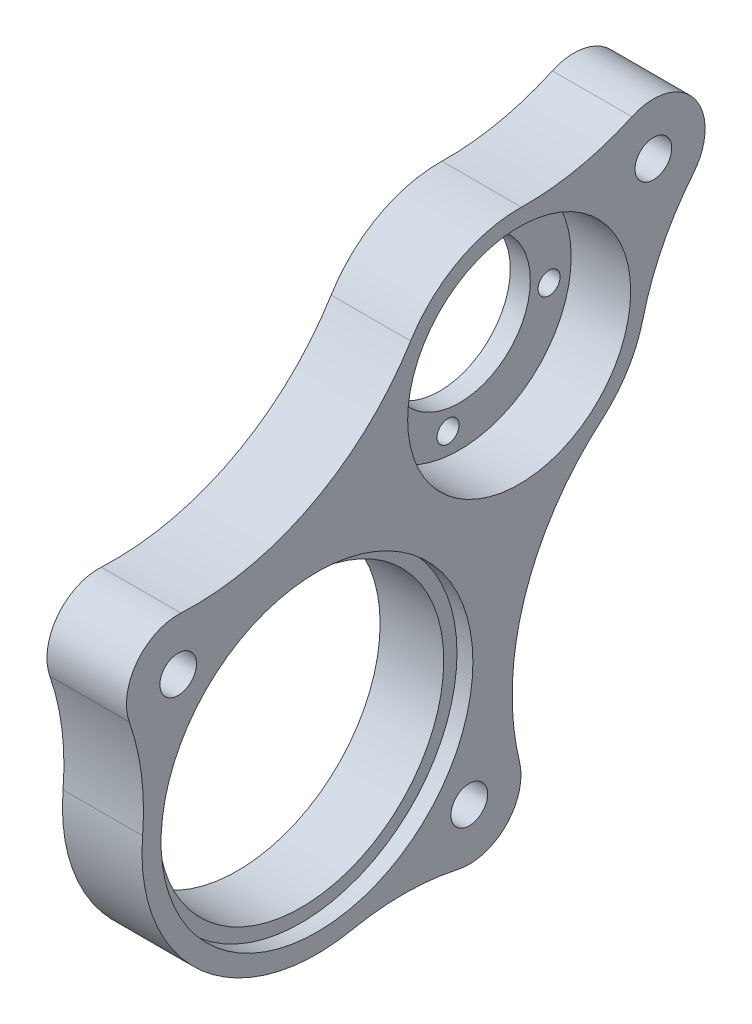
ISO-10303-21;
HEADER;
FILE_DESCRIPTION(('STEP AP214'),'2;1');
FILE_NAME('part.step','',(''),(''),'','','');
FILE_SCHEMA(('AUTOMOTIVE_DESIGN { 1 0 10303 214 1 1 1 1 }'));
ENDSEC;
DATA;
#1=APPLICATION_CONTEXT('core data for automotive mechanical design processes');
#2=APPLICATION_PROTOCOL_DEFINITION('international standard','automotive_design',2000,#1);
#3=PRODUCT_CONTEXT('',#1,'mechanical');
#4=PRODUCT('Part','Part','',(#3));
#5=PRODUCT_RELATED_PRODUCT_CATEGORY('part','',(#4));
#6=PRODUCT_DEFINITION_FORMATION('','',#4);
#7=PRODUCT_DEFINITION_CONTEXT('part definition',#1,'design');
#8=PRODUCT_DEFINITION('design','',#6,#7);
#9=PRODUCT_DEFINITION_SHAPE('','',#8);
#10=(LENGTH_UNIT() NAMED_UNIT(*) SI_UNIT(.MILLI.,.METRE.));
#11=(NAMED_UNIT(*) PLANE_ANGLE_UNIT() SI_UNIT($,.RADIAN.));
#12=(NAMED_UNIT(*) SI_UNIT($,.STERADIAN.) SOLID_ANGLE_UNIT());
#13=UNCERTAINTY_MEASURE_WITH_UNIT(LENGTH_MEASURE(1.E-05),#10,'distance_accuracy_value','');
#14=(GEOMETRIC_REPRESENTATION_CONTEXT(3) GLOBAL_UNCERTAINTY_ASSIGNED_CONTEXT((#13)) GLOBAL_UNIT_ASSIGNED_CONTEXT((#10,
#11,#12)) REPRESENTATION_CONTEXT('',''));
#15=CARTESIAN_POINT('',(0.,0.,0.));
#16=DIRECTION('',(0.,0.,1.));
#17=DIRECTION('',(1.,0.,0.));
#18=AXIS2_PLACEMENT_3D('',#15,#16,#17);
#19=CARTESIAN_POINT('',(-54.0385,40.64,-143.949968041871));
#20=DIRECTION('',(1.,0.,0.));
#21=DIRECTION('',(0.,0.,-1.));
#22=AXIS2_PLACEMENT_3D('',#19,#20,#21);
#23=CYLINDRICAL_SURFACE('',#22,14.2367);
#24=CARTESIAN_POINT('',(-54.0385,40.64,-143.949968041871));
#25=DIRECTION('',(-1.,0.,0.));
#26=DIRECTION('',(0.,0.,1.));
#27=AXIS2_PLACEMENT_3D('',#24,#25,#26);
#28=CIRCLE('',#27,14.2367);
#29=CARTESIAN_POINT('',(-54.0385,40.64,-129.713268041871));
#30=VERTEX_POINT('',#29);
#31=EDGE_CURVE('E186',#30,#30,#28,.T.);
#32=ORIENTED_EDGE('',*,*,#31,.T.);
#33=EDGE_LOOP('',(#32));
#34=FACE_BOUND('',#33,.T.);
#35=CARTESIAN_POINT('',(-47.6885,40.64,-143.949968041871));
#36=DIRECTION('',(1.,0.,0.));
#37=DIRECTION('',(0.,0.,-1.));
#38=AXIS2_PLACEMENT_3D('',#35,#36,#37);
#39=CIRCLE('',#38,14.2367);
#40=CARTESIAN_POINT('',(-47.6885,40.64,-158.186668041871));
#41=VERTEX_POINT('',#40);
#42=EDGE_CURVE('E57',#41,#41,#39,.T.);
#43=ORIENTED_EDGE('',*,*,#42,.T.);
#44=EDGE_LOOP('',(#43));
#45=FACE_BOUND('',#44,.T.);
#46=ADVANCED_FACE('F53',(#34,#45),#23,.F.);
#47=CARTESIAN_POINT('',(-54.0385,73.7443887278039,-165.280840759905));
#48=DIRECTION('',(1.,0.,0.));
#49=DIRECTION('',(0.,0.,-1.));
#50=AXIS2_PLACEMENT_3D('',#47,#48,#49);
#51=CYLINDRICAL_SURFACE('',#50,1.09999999999988);
#52=CARTESIAN_POINT('',(-54.0385,73.7443887278039,-165.280840759905));
#53=DIRECTION('',(-1.,0.,0.));
#54=DIRECTION('',(0.,0.,1.));
#55=AXIS2_PLACEMENT_3D('',#52,#53,#54);
#56=CIRCLE('',#55,1.09999999999988);
#57=CARTESIAN_POINT('',(-54.0385,73.7443887278039,-164.180840759905));
#58=VERTEX_POINT('',#57);
#59=EDGE_CURVE('E198',#58,#58,#56,.T.);
#60=ORIENTED_EDGE('',*,*,#59,.T.);
#61=EDGE_LOOP('',(#60));
#62=FACE_BOUND('',#61,.T.);
#63=CARTESIAN_POINT('',(-52.0385,73.7443887278039,-165.280840759905));
#64=DIRECTION('',(1.,0.,0.));
#65=DIRECTION('',(0.,0.,-1.));
#66=AXIS2_PLACEMENT_3D('',#63,#64,#65);
#67=CIRCLE('',#66,1.09999999999988);
#68=CARTESIAN_POINT('',(-52.0385,73.7443887278039,-166.380840759905));
#69=VERTEX_POINT('',#68);
#70=EDGE_CURVE('E208',#69,#69,#67,.T.);
#71=ORIENTED_EDGE('',*,*,#70,.T.);
#72=EDGE_LOOP('',(#71));
#73=FACE_BOUND('',#72,.T.);
#74=ADVANCED_FACE('F362',(#62,#73),#51,.F.);
#75=CARTESIAN_POINT('',(-54.0385,63.6625242944224,-173.049753782131));
#76=DIRECTION('',(1.,0.,0.));
#77=DIRECTION('',(0.,0.,-1.));
#78=AXIS2_PLACEMENT_3D('',#75,#76,#77);
#79=CYLINDRICAL_SURFACE('',#78,1.09999999999999);
#80=CARTESIAN_POINT('',(-54.0385,63.6625242944224,-173.049753782131));
#81=DIRECTION('',(-1.,0.,0.));
#82=DIRECTION('',(0.,0.,1.));
#83=AXIS2_PLACEMENT_3D('',#80,#81,#82);
#84=CIRCLE('',#83,1.09999999999999);
#85=CARTESIAN_POINT('',(-54.0385,63.6625242944224,-171.949753782131));
#86=VERTEX_POINT('',#85);
#87=EDGE_CURVE('E195',#86,#86,#84,.T.);
#88=ORIENTED_EDGE('',*,*,#87,.T.);
#89=EDGE_LOOP('',(#88));
#90=FACE_BOUND('',#89,.T.);
#91=CARTESIAN_POINT('',(-52.0385,63.6625242944224,-173.049753782131));
#92=DIRECTION('',(1.,0.,0.));
#93=DIRECTION('',(0.,0.,-1.));
#94=AXIS2_PLACEMENT_3D('',#91,#92,#93);
#95=CIRCLE('',#94,1.09999999999999);
#96=CARTESIAN_POINT('',(-52.0385,63.6625242944224,-174.149753782131));
#97=VERTEX_POINT('',#96);
#98=EDGE_CURVE('E308',#97,#97,#95,.T.);
#99=ORIENTED_EDGE('',*,*,#98,.T.);
#100=EDGE_LOOP('',(#99));
#101=FACE_BOUND('',#100,.T.);
#102=ADVANCED_FACE('F368',(#90,#101),#79,.F.);
#103=CARTESIAN_POINT('',(-54.0385,55.8936112721961,-162.96788934875));
#104=DIRECTION('',(1.,0.,0.));
#105=DIRECTION('',(0.,0.,-1.));
#106=AXIS2_PLACEMENT_3D('',#103,#104,#105);
#107=CYLINDRICAL_SURFACE('',#106,1.09999999999964);
#108=CARTESIAN_POINT('',(-54.0385,55.8936112721961,-162.96788934875));
#109=DIRECTION('',(-1.,0.,0.));
#110=DIRECTION('',(0.,0.,1.));
#111=AXIS2_PLACEMENT_3D('',#108,#109,#110);
#112=CIRCLE('',#111,1.09999999999964);
#113=CARTESIAN_POINT('',(-54.0385,55.8936112721961,-161.86788934875));
#114=VERTEX_POINT('',#113);
#115=EDGE_CURVE('E192',#114,#114,#112,.T.);
#116=ORIENTED_EDGE('',*,*,#115,.T.);
#117=EDGE_LOOP('',(#116));
#118=FACE_BOUND('',#117,.T.);
#119=CARTESIAN_POINT('',(-52.0385,55.8936112721961,-162.96788934875));
#120=DIRECTION('',(1.,0.,0.));
#121=DIRECTION('',(0.,0.,-1.));
#122=AXIS2_PLACEMENT_3D('',#119,#120,#121);
#123=CIRCLE('',#122,1.09999999999964);
#124=CARTESIAN_POINT('',(-52.0385,55.8936112721961,-164.067889348749));
#125=VERTEX_POINT('',#124);
#126=EDGE_CURVE('E305',#125,#125,#123,.T.);
#127=ORIENTED_EDGE('',*,*,#126,.T.);
#128=EDGE_LOOP('',(#127));
#129=FACE_BOUND('',#128,.T.);
#130=ADVANCED_FACE('F613',(#118,#129),#107,.F.);
#131=CARTESIAN_POINT('',(-54.0385,65.9754757055776,-155.198976326523));
#132=DIRECTION('',(1.,0.,0.));
#133=DIRECTION('',(0.,0.,-1.));
#134=AXIS2_PLACEMENT_3D('',#131,#132,#133);
#135=CYLINDRICAL_SURFACE('',#134,1.10000000000011);
#136=CARTESIAN_POINT('',(-54.0385,65.9754757055776,-155.198976326523));
#137=DIRECTION('',(-1.,0.,0.));
#138=DIRECTION('',(0.,0.,1.));
#139=AXIS2_PLACEMENT_3D('',#136,#137,#138);
#140=CIRCLE('',#139,1.10000000000011);
#141=CARTESIAN_POINT('',(-54.0385,65.9754757055776,-154.098976326523));
#142=VERTEX_POINT('',#141);
#143=EDGE_CURVE('E189',#142,#142,#140,.T.);
#144=ORIENTED_EDGE('',*,*,#143,.T.);
#145=EDGE_LOOP('',(#144));
#146=FACE_BOUND('',#145,.T.);
#147=CARTESIAN_POINT('',(-52.0385,65.9754757055776,-155.198976326523));
#148=DIRECTION('',(1.,0.,0.));
#149=DIRECTION('',(0.,0.,-1.));
#150=AXIS2_PLACEMENT_3D('',#147,#148,#149);
#151=CIRCLE('',#150,1.10000000000011);
#152=CARTESIAN_POINT('',(-52.0385,65.9754757055776,-156.298976326523));
#153=VERTEX_POINT('',#152);
#154=EDGE_CURVE('E258',#153,#153,#151,.T.);
#155=ORIENTED_EDGE('',*,*,#154,.T.);
#156=EDGE_LOOP('',(#155));
#157=FACE_BOUND('',#156,.T.);
#158=ADVANCED_FACE('F374',(#146,#157),#135,.F.);
#159=CARTESIAN_POINT('',(-54.0385,64.819,-164.124365054327));
#160=DIRECTION('',(1.,0.,0.));
#161=DIRECTION('',(0.,0.,-1.));
#162=AXIS2_PLACEMENT_3D('',#159,#160,#161);
#163=CYLINDRICAL_SURFACE('',#162,7.05000000000001);
#164=CARTESIAN_POINT('',(-54.0385,64.819,-164.124365054327));
#165=DIRECTION('',(-1.,0.,0.));
#166=DIRECTION('',(0.,0.,1.));
#167=AXIS2_PLACEMENT_3D('',#164,#165,#166);
#168=CIRCLE('',#167,7.05000000000001);
#169=CARTESIAN_POINT('',(-54.0385,64.819,-157.074365054327));
#170=VERTEX_POINT('',#169);
#171=EDGE_CURVE('E201',#170,#170,#168,.T.);
#172=ORIENTED_EDGE('',*,*,#171,.T.);
#173=EDGE_LOOP('',(#172));
#174=FACE_BOUND('',#173,.T.);
#175=CARTESIAN_POINT('',(-52.0385,64.819,-164.124365054327));
#176=DIRECTION('',(1.,0.,0.));
#177=DIRECTION('',(0.,0.,-1.));
#178=AXIS2_PLACEMENT_3D('',#175,#176,#177);
#179=CIRCLE('',#178,7.05000000000001);
#180=CARTESIAN_POINT('',(-52.0385,64.819,-171.174365054327));
#181=VERTEX_POINT('',#180);
#182=EDGE_CURVE('E255',#181,#181,#179,.T.);
#183=ORIENTED_EDGE('',*,*,#182,.T.);
#184=EDGE_LOOP('',(#183));
#185=FACE_BOUND('',#184,.T.);
#186=ADVANCED_FACE('F359',(#174,#185),#163,.F.);
#187=CARTESIAN_POINT('',(-54.0385,28.5019500000001,-159.144486375717));
#188=DIRECTION('',(1.,0.,0.));
#189=DIRECTION('',(0.,0.,-1.));
#190=AXIS2_PLACEMENT_3D('',#187,#188,#189);
#191=CYLINDRICAL_SURFACE('',#190,5.16000999999998);
#192=CARTESIAN_POINT('',(-46.101,28.5019500000001,-159.144486375717));
#193=DIRECTION('',(-1.,0.,0.));
#194=DIRECTION('',(0.,0.,1.));
#195=AXIS2_PLACEMENT_3D('',#192,#193,#194);
#196=CIRCLE('',#195,5.16000999999998);
#197=CARTESIAN_POINT('',(-46.101,29.732471235992,-164.155626035303));
#198=VERTEX_POINT('',#197);
#199=CARTESIAN_POINT('',(-46.101,23.462389320862,-158.036095036259));
#200=VERTEX_POINT('',#199);
#201=EDGE_CURVE('E205',#198,#200,#196,.T.);
#202=ORIENTED_EDGE('',*,*,#201,.T.);
#203=DIRECTION('',(1.,0.,0.));
#204=VECTOR('',#203,1.);
#205=CARTESIAN_POINT('',(-54.0385,23.462389320862,-158.036095036259));
#206=LINE('',#205,#204);
#207=CARTESIAN_POINT('',(-54.0385,23.462389320862,-158.036095036259));
#208=VERTEX_POINT('',#207);
#209=EDGE_CURVE('E70',#200,#208,#206,.F.);
#210=ORIENTED_EDGE('',*,*,#209,.T.);
#211=CARTESIAN_POINT('',(-54.0385,28.5019500000001,-159.144486375717));
#212=DIRECTION('',(-1.,0.,0.));
#213=DIRECTION('',(0.,0.,1.));
#214=AXIS2_PLACEMENT_3D('',#211,#212,#213);
#215=CIRCLE('',#214,5.16000999999998);
#216=CARTESIAN_POINT('',(-54.0385,29.732471235992,-164.155626035303));
#217=VERTEX_POINT('',#216);
#218=EDGE_CURVE('E227',#217,#208,#215,.T.);
#219=ORIENTED_EDGE('',*,*,#218,.F.);
#220=DIRECTION('',(1.,0.,0.));
#221=VECTOR('',#220,1.);
#222=CARTESIAN_POINT('',(-54.0385,29.732471235992,-164.155626035303));
#223=LINE('',#222,#221);
#224=EDGE_CURVE('E204',#217,#198,#223,.T.);
#225=ORIENTED_EDGE('',*,*,#224,.T.);
#226=EDGE_LOOP('',(#202,#210,#219,#225));
#227=FACE_BOUND('',#226,.T.);
#228=ADVANCED_FACE('F349',(#227),#191,.T.);
#229=CARTESIAN_POINT('',(-54.0385,40.64,-143.949968041871));
#230=DIRECTION('',(1.,0.,0.));
#231=DIRECTION('',(0.,0.,-1.));
#232=AXIS2_PLACEMENT_3D('',#229,#230,#231);
#233=CYLINDRICAL_SURFACE('',#232,17.4625);
#234=CARTESIAN_POINT('',(-46.101,40.64,-143.949968041871));
#235=DIRECTION('',(-1.,0.,0.));
#236=DIRECTION('',(0.,0.,1.));
#237=AXIS2_PLACEMENT_3D('',#234,#235,#236);
#238=CIRCLE('',#237,17.4625);
#239=CARTESIAN_POINT('',(-46.101,23.5351212523761,-147.465935800409));
#240=VERTEX_POINT('',#239);
#241=CARTESIAN_POINT('',(-46.101,42.108524142811,-126.549326010843));
#242=VERTEX_POINT('',#241);
#243=EDGE_CURVE('E207',#240,#242,#238,.T.);
#244=ORIENTED_EDGE('',*,*,#243,.T.);
#245=DIRECTION('',(1.,0.,0.));
#246=VECTOR('',#245,1.);
#247=CARTESIAN_POINT('',(-54.0385,42.108524142811,-126.549326010843));
#248=LINE('',#247,#246);
#249=CARTESIAN_POINT('',(-54.0385,42.108524142811,-126.549326010843));
#250=VERTEX_POINT('',#249);
#251=EDGE_CURVE('E248',#242,#250,#248,.F.);
#252=ORIENTED_EDGE('',*,*,#251,.T.);
#253=CARTESIAN_POINT('',(-54.0385,40.64,-143.949968041871));
#254=DIRECTION('',(-1.,0.,0.));
#255=DIRECTION('',(0.,0.,1.));
#256=AXIS2_PLACEMENT_3D('',#253,#254,#255);
#257=CIRCLE('',#256,17.4625);
#258=CARTESIAN_POINT('',(-54.0385,23.5351212523761,-147.465935800409));
#259=VERTEX_POINT('',#258);
#260=EDGE_CURVE('E156',#259,#250,#257,.T.);
#261=ORIENTED_EDGE('',*,*,#260,.F.);
#262=DIRECTION('',(1.,0.,0.));
#263=VECTOR('',#262,1.);
#264=CARTESIAN_POINT('',(-54.0385,23.5351212523761,-147.465935800409));
#265=LINE('',#264,#263);
#266=EDGE_CURVE('E245',#259,#240,#265,.T.);
#267=ORIENTED_EDGE('',*,*,#266,.T.);
#268=EDGE_LOOP('',(#244,#252,#261,#267));
#269=FACE_BOUND('',#268,.T.);
#270=ADVANCED_FACE('F351',(#269),#233,.T.);
#271=CARTESIAN_POINT('',(-54.0385,54.2924889549761,-130.100231924011));
#272=DIRECTION('',(1.,0.,0.));
#273=DIRECTION('',(0.,0.,-1.));
#274=AXIS2_PLACEMENT_3D('',#271,#272,#273);
#275=CYLINDRICAL_SURFACE('',#274,5.16000999999998);
#276=CARTESIAN_POINT('',(-54.0385,54.2924889549761,-130.100231924011));
#277=DIRECTION('',(-1.,0.,0.));
#278=DIRECTION('',(0.,0.,1.));
#279=AXIS2_PLACEMENT_3D('',#276,#277,#278);
#280=CIRCLE('',#279,5.16000999999998);
#281=CARTESIAN_POINT('',(-54.0385,52.5959117055806,-125.22710881486));
#282=VERTEX_POINT('',#281);
#283=CARTESIAN_POINT('',(-54.0385,59.4456484389902,-130.36603360274));
#284=VERTEX_POINT('',#283);
#285=EDGE_CURVE('E144',#282,#284,#280,.T.);
#286=ORIENTED_EDGE('',*,*,#285,.F.);
#287=DIRECTION('',(1.,0.,0.));
#288=VECTOR('',#287,1.);
#289=CARTESIAN_POINT('',(-54.0385,52.5959117055806,-125.22710881486));
#290=LINE('',#289,#288);
#291=CARTESIAN_POINT('',(-46.101,52.5959117055806,-125.22710881486));
#292=VERTEX_POINT('',#291);
#293=EDGE_CURVE('E166',#282,#292,#290,.T.);
#294=ORIENTED_EDGE('',*,*,#293,.T.);
#295=CARTESIAN_POINT('',(-46.101,54.2924889549761,-130.100231924011));
#296=DIRECTION('',(-1.,0.,0.));
#297=DIRECTION('',(0.,0.,1.));
#298=AXIS2_PLACEMENT_3D('',#295,#296,#297);
#299=CIRCLE('',#298,5.16000999999998);
#300=CARTESIAN_POINT('',(-46.101,59.4456484389902,-130.36603360274));
#301=VERTEX_POINT('',#300);
#302=EDGE_CURVE('E162',#292,#301,#299,.T.);
#303=ORIENTED_EDGE('',*,*,#302,.T.);
#304=DIRECTION('',(1.,0.,0.));
#305=VECTOR('',#304,1.);
#306=CARTESIAN_POINT('',(-54.0385,59.4456484389902,-130.36603360274));
#307=LINE('',#306,#305);
#308=EDGE_CURVE('E159',#284,#301,#307,.T.);
#309=ORIENTED_EDGE('',*,*,#308,.F.);
#310=EDGE_LOOP('',(#286,#294,#303,#309));
#311=FACE_BOUND('',#310,.T.);
#312=ADVANCED_FACE('F160',(#311),#275,.T.);
#313=CARTESIAN_POINT('',(-54.0385,84.8119269721633,-131.674434679429));
#314=DIRECTION('',(1.,0.,0.));
#315=DIRECTION('',(0.,0.,-1.));
#316=AXIS2_PLACEMENT_3D('',#313,#314,#315);
#317=CYLINDRICAL_SURFACE('',#316,25.4);
#318=CARTESIAN_POINT('',(-46.101,84.8119269721633,-131.674434679429));
#319=DIRECTION('',(-1.,0.,0.));
#320=DIRECTION('',(0.,0.,1.));
#321=AXIS2_PLACEMENT_3D('',#318,#319,#320);
#322=CIRCLE('',#321,25.4);
#323=CARTESIAN_POINT('',(-46.101,71.4883796320972,-153.299491587493));
#324=VERTEX_POINT('',#323);
#325=EDGE_CURVE('E212',#324,#301,#322,.T.);
#326=ORIENTED_EDGE('',*,*,#325,.F.);
#327=DIRECTION('',(1.,0.,0.));
#328=VECTOR('',#327,1.);
#329=CARTESIAN_POINT('',(-54.0385,71.4883796320972,-153.299491587493));
#330=LINE('',#329,#328);
#331=CARTESIAN_POINT('',(-54.0385,71.4883796320972,-153.299491587493));
#332=VERTEX_POINT('',#331);
#333=EDGE_CURVE('E167',#332,#324,#330,.T.);
#334=ORIENTED_EDGE('',*,*,#333,.F.);
#335=CARTESIAN_POINT('',(-54.0385,84.8119269721633,-131.674434679429));
#336=DIRECTION('',(-1.,0.,0.));
#337=DIRECTION('',(0.,0.,1.));
#338=AXIS2_PLACEMENT_3D('',#335,#336,#337);
#339=CIRCLE('',#338,25.4);
#340=EDGE_CURVE('E149',#332,#284,#339,.T.);
#341=ORIENTED_EDGE('',*,*,#340,.T.);
#342=ORIENTED_EDGE('',*,*,#308,.T.);
#343=EDGE_LOOP('',(#326,#334,#341,#342));
#344=FACE_BOUND('',#343,.T.);
#345=ADVANCED_FACE('F169',(#344),#317,.F.);
#346=CARTESIAN_POINT('',(-54.0385,64.819,-164.124365054327));
#347=DIRECTION('',(1.,0.,0.));
#348=DIRECTION('',(0.,0.,-1.));
#349=AXIS2_PLACEMENT_3D('',#346,#347,#348);
#350=CYLINDRICAL_SURFACE('',#349,12.7145);
#351=CARTESIAN_POINT('',(-46.101,64.819,-164.124365054327));
#352=DIRECTION('',(-1.,0.,0.));
#353=DIRECTION('',(0.,0.,1.));
#354=AXIS2_PLACEMENT_3D('',#351,#352,#353);
#355=CIRCLE('',#354,12.7145);
#356=CARTESIAN_POINT('',(-46.101,77.531503941374,-164.349651073758));
#357=VERTEX_POINT('',#356);
#358=EDGE_CURVE('E214',#324,#357,#355,.T.);
#359=ORIENTED_EDGE('',*,*,#358,.T.);
#360=DIRECTION('',(1.,0.,0.));
#361=VECTOR('',#360,1.);
#362=CARTESIAN_POINT('',(-54.0385,77.531503941374,-164.349651073758));
#363=LINE('',#362,#361);
#364=CARTESIAN_POINT('',(-54.0385,77.531503941374,-164.349651073758));
#365=VERTEX_POINT('',#364);
#366=EDGE_CURVE('E241',#365,#357,#363,.T.);
#367=ORIENTED_EDGE('',*,*,#366,.F.);
#368=CARTESIAN_POINT('',(-54.0385,64.819,-164.124365054327));
#369=DIRECTION('',(-1.,0.,0.));
#370=DIRECTION('',(0.,0.,1.));
#371=AXIS2_PLACEMENT_3D('',#368,#369,#370);
#372=CIRCLE('',#371,12.7145);
#373=EDGE_CURVE('E171',#332,#365,#372,.T.);
#374=ORIENTED_EDGE('',*,*,#373,.F.);
#375=ORIENTED_EDGE('',*,*,#333,.T.);
#376=EDGE_LOOP('',(#359,#367,#374,#375));
#377=FACE_BOUND('',#376,.T.);
#378=ADVANCED_FACE('F326',(#377),#350,.T.);
#379=CARTESIAN_POINT('',(-54.0385,102.927516376853,-164.79970926665));
#380=DIRECTION('',(1.,0.,0.));
#381=DIRECTION('',(0.,0.,-1.));
#382=AXIS2_PLACEMENT_3D('',#379,#380,#381);
#383=CYLINDRICAL_SURFACE('',#382,25.4);
#384=CARTESIAN_POINT('',(-46.101,102.927516376853,-164.79970926665));
#385=DIRECTION('',(-1.,0.,0.));
#386=DIRECTION('',(0.,0.,1.));
#387=AXIS2_PLACEMENT_3D('',#384,#385,#386);
#388=CIRCLE('',#387,25.4);
#389=CARTESIAN_POINT('',(-46.101,79.8315047599698,-175.37015142357));
#390=VERTEX_POINT('',#389);
#391=EDGE_CURVE('E217',#390,#357,#388,.T.);
#392=ORIENTED_EDGE('',*,*,#391,.F.);
#393=DIRECTION('',(1.,0.,0.));
#394=VECTOR('',#393,1.);
#395=CARTESIAN_POINT('',(-54.0385,79.8315047599698,-175.37015142357));
#396=LINE('',#395,#394);
#397=CARTESIAN_POINT('',(-54.0385,79.8315047599698,-175.37015142357));
#398=VERTEX_POINT('',#397);
#399=EDGE_CURVE('E239',#398,#390,#396,.T.);
#400=ORIENTED_EDGE('',*,*,#399,.F.);
#401=CARTESIAN_POINT('',(-54.0385,102.927516376853,-164.79970926665));
#402=DIRECTION('',(-1.,0.,0.));
#403=DIRECTION('',(0.,0.,1.));
#404=AXIS2_PLACEMENT_3D('',#401,#402,#403);
#405=CIRCLE('',#404,25.4);
#406=EDGE_CURVE('E173',#398,#365,#405,.T.);
#407=ORIENTED_EDGE('',*,*,#406,.T.);
#408=ORIENTED_EDGE('',*,*,#366,.T.);
#409=EDGE_LOOP('',(#392,#400,#407,#408));
#410=FACE_BOUND('',#409,.T.);
#411=ADVANCED_FACE('F331',(#410),#383,.F.);
#412=CARTESIAN_POINT('',(-54.0385,75.1395499999999,-177.517536747748));
#413=DIRECTION('',(1.,0.,0.));
#414=DIRECTION('',(0.,0.,-1.));
#415=AXIS2_PLACEMENT_3D('',#412,#413,#414);
#416=CYLINDRICAL_SURFACE('',#415,5.16000999999998);
#417=CARTESIAN_POINT('',(-46.101,75.1395499999999,-177.517536747748));
#418=DIRECTION('',(-1.,0.,0.));
#419=DIRECTION('',(0.,0.,1.));
#420=AXIS2_PLACEMENT_3D('',#417,#418,#419);
#421=CIRCLE('',#420,5.16000999999998);
#422=CARTESIAN_POINT('',(-46.101,71.8672672912919,-181.507257173341));
#423=VERTEX_POINT('',#422);
#424=EDGE_CURVE('E221',#390,#423,#421,.T.);
#425=ORIENTED_EDGE('',*,*,#424,.T.);
#426=DIRECTION('',(1.,0.,0.));
#427=VECTOR('',#426,1.);
#428=CARTESIAN_POINT('',(-54.0385,71.8672672912919,-181.507257173341));
#429=LINE('',#428,#427);
#430=CARTESIAN_POINT('',(-54.0385,71.8672672912919,-181.507257173341));
#431=VERTEX_POINT('',#430);
#432=EDGE_CURVE('E236',#431,#423,#429,.T.);
#433=ORIENTED_EDGE('',*,*,#432,.F.);
#434=CARTESIAN_POINT('',(-54.0385,75.1395499999999,-177.517536747748));
#435=DIRECTION('',(-1.,0.,0.));
#436=DIRECTION('',(0.,0.,1.));
#437=AXIS2_PLACEMENT_3D('',#434,#435,#436);
#438=CIRCLE('',#437,5.16000999999998);
#439=EDGE_CURVE('E180',#398,#431,#438,.T.);
#440=ORIENTED_EDGE('',*,*,#439,.F.);
#441=ORIENTED_EDGE('',*,*,#399,.T.);
#442=EDGE_LOOP('',(#425,#433,#440,#441));
#443=FACE_BOUND('',#442,.T.);
#444=ADVANCED_FACE('F333',(#443),#416,.T.);
#445=CARTESIAN_POINT('',(-54.0385,55.7595502905137,-201.14654058753));
#446=DIRECTION('',(1.,0.,0.));
#447=DIRECTION('',(0.,0.,-1.));
#448=AXIS2_PLACEMENT_3D('',#445,#446,#447);
#449=CYLINDRICAL_SURFACE('',#448,25.4);
#450=CARTESIAN_POINT('',(-46.101,55.7595502905137,-201.14654058753));
#451=DIRECTION('',(-1.,0.,0.));
#452=DIRECTION('',(0.,0.,1.));
#453=AXIS2_PLACEMENT_3D('',#450,#451,#452);
#454=CIRCLE('',#453,25.4);
#455=CARTESIAN_POINT('',(-46.101,61.7968857565687,-176.474479861472));
#456=VERTEX_POINT('',#455);
#457=EDGE_CURVE('E223',#423,#456,#454,.F.);
#458=ORIENTED_EDGE('',*,*,#457,.T.);
#459=DIRECTION('',(1.,0.,0.));
#460=VECTOR('',#459,1.);
#461=CARTESIAN_POINT('',(-54.0385,61.7968857565687,-176.474479861472));
#462=LINE('',#461,#460);
#463=CARTESIAN_POINT('',(-54.0385,61.7968857565687,-176.474479861472));
#464=VERTEX_POINT('',#463);
#465=EDGE_CURVE('E233',#464,#456,#462,.T.);
#466=ORIENTED_EDGE('',*,*,#465,.F.);
#467=CARTESIAN_POINT('',(-54.0385,55.7595502905137,-201.14654058753));
#468=DIRECTION('',(-1.,0.,0.));
#469=DIRECTION('',(0.,0.,1.));
#470=AXIS2_PLACEMENT_3D('',#467,#468,#469);
#471=CIRCLE('',#470,25.4);
#472=EDGE_CURVE('E182',#431,#464,#471,.F.);
#473=ORIENTED_EDGE('',*,*,#472,.F.);
#474=ORIENTED_EDGE('',*,*,#432,.T.);
#475=EDGE_LOOP('',(#458,#466,#473,#474));
#476=FACE_BOUND('',#475,.T.);
#477=ADVANCED_FACE('F338',(#476),#449,.F.);
#478=CARTESIAN_POINT('',(-46.101,55.1351963431537,-172.363446130858));
#479=VERTEX_POINT('',#478);
#480=EDGE_CURVE('E218',#456,#479,#355,.T.);
#481=ORIENTED_EDGE('',*,*,#480,.T.);
#482=DIRECTION('',(1.,0.,0.));
#483=VECTOR('',#482,1.);
#484=CARTESIAN_POINT('',(-54.0385,55.1351963431537,-172.363446130858));
#485=LINE('',#484,#483);
#486=CARTESIAN_POINT('',(-54.0385,55.1351963431537,-172.363446130858));
#487=VERTEX_POINT('',#486);
#488=EDGE_CURVE('E230',#487,#479,#485,.T.);
#489=ORIENTED_EDGE('',*,*,#488,.F.);
#490=EDGE_CURVE('E175',#464,#487,#372,.T.);
#491=ORIENTED_EDGE('',*,*,#490,.F.);
#492=ORIENTED_EDGE('',*,*,#465,.T.);
#493=EDGE_LOOP('',(#481,#489,#491,#492));
#494=FACE_BOUND('',#493,.T.);
#495=ADVANCED_FACE('F344',(#494),#350,.T.);
#496=CARTESIAN_POINT('',(-54.0385,35.7896764340816,-188.822816089872));
#497=DIRECTION('',(1.,0.,0.));
#498=DIRECTION('',(0.,0.,-1.));
#499=AXIS2_PLACEMENT_3D('',#496,#497,#498);
#500=CYLINDRICAL_SURFACE('',#499,25.4);
#501=CARTESIAN_POINT('',(-46.101,35.7896764340816,-188.822816089872));
#502=DIRECTION('',(-1.,0.,0.));
#503=DIRECTION('',(0.,0.,1.));
#504=AXIS2_PLACEMENT_3D('',#501,#502,#503);
#505=CIRCLE('',#504,25.4);
#506=EDGE_CURVE('E225',#479,#198,#505,.F.);
#507=ORIENTED_EDGE('',*,*,#506,.T.);
#508=ORIENTED_EDGE('',*,*,#224,.F.);
#509=CARTESIAN_POINT('',(-54.0385,35.7896764340816,-188.822816089872));
#510=DIRECTION('',(-1.,0.,0.));
#511=DIRECTION('',(0.,0.,1.));
#512=AXIS2_PLACEMENT_3D('',#509,#510,#511);
#513=CIRCLE('',#512,25.4);
#514=EDGE_CURVE('E184',#487,#217,#513,.F.);
#515=ORIENTED_EDGE('',*,*,#514,.F.);
#516=ORIENTED_EDGE('',*,*,#488,.T.);
#517=EDGE_LOOP('',(#507,#508,#515,#516));
#518=FACE_BOUND('',#517,.T.);
#519=ADVANCED_FACE('F348',(#518),#500,.F.);
#520=CARTESIAN_POINT('',(-54.0385,0.,0.));
#521=DIRECTION('',(-1.,0.,0.));
#522=DIRECTION('',(0.,0.,1.));
#523=AXIS2_PLACEMENT_3D('',#520,#521,#522);
#524=PLANE('',#523);
#525=CARTESIAN_POINT('',(-54.0385,75.1395499999999,-177.517536747748));
#526=DIRECTION('',(-1.,0.,0.));
#527=DIRECTION('',(0.,0.,1.));
#528=AXIS2_PLACEMENT_3D('',#525,#526,#527);
#529=CIRCLE('',#528,3.57250999999999);
#530=CARTESIAN_POINT('',(-54.0385,75.1395499999999,-173.945026747749));
#531=VERTEX_POINT('',#530);
#532=EDGE_CURVE('E284',#531,#531,#529,.T.);
#533=ORIENTED_EDGE('',*,*,#532,.F.);
#534=EDGE_LOOP('',(#533));
#535=FACE_BOUND('',#534,.T.);
#536=CARTESIAN_POINT('',(-54.0385,54.2924889549761,-130.100231924011));
#537=DIRECTION('',(-1.,0.,0.));
#538=DIRECTION('',(0.,0.,1.));
#539=AXIS2_PLACEMENT_3D('',#536,#537,#538);
#540=CIRCLE('',#539,3.57250999999999);
#541=CARTESIAN_POINT('',(-54.0385,54.2924889549761,-126.527721924011));
#542=VERTEX_POINT('',#541);
#543=EDGE_CURVE('E271',#542,#542,#540,.T.);
#544=ORIENTED_EDGE('',*,*,#543,.F.);
#545=EDGE_LOOP('',(#544));
#546=FACE_BOUND('',#545,.T.);
#547=CARTESIAN_POINT('',(-54.0385,28.5019500000001,-159.144486375717));
#548=DIRECTION('',(-1.,0.,0.));
#549=DIRECTION('',(0.,0.,1.));
#550=AXIS2_PLACEMENT_3D('',#547,#548,#549);
#551=CIRCLE('',#550,3.57250999999999);
#552=CARTESIAN_POINT('',(-54.0385,28.5019500000001,-155.571976375717));
#553=VERTEX_POINT('',#552);
#554=EDGE_CURVE('E267',#553,#553,#551,.T.);
#555=ORIENTED_EDGE('',*,*,#554,.F.);
#556=EDGE_LOOP('',(#555));
#557=FACE_BOUND('',#556,.T.);
#558=ORIENTED_EDGE('',*,*,#218,.T.);
#559=CARTESIAN_POINT('',(-54.0385,-1.34470238053139,-152.58007072192));
#560=DIRECTION('',(-1.,0.,0.));
#561=DIRECTION('',(0.,0.,1.));
#562=AXIS2_PLACEMENT_3D('',#559,#560,#561);
#563=CIRCLE('',#562,25.4);
#564=EDGE_CURVE('E12',#208,#259,#563,.F.);
#565=ORIENTED_EDGE('',*,*,#564,.T.);
#566=ORIENTED_EDGE('',*,*,#260,.T.);
#567=CARTESIAN_POINT('',(-54.0385,44.2445592596269,-101.239301238438));
#568=DIRECTION('',(-1.,0.,0.));
#569=DIRECTION('',(0.,0.,1.));
#570=AXIS2_PLACEMENT_3D('',#567,#568,#569);
#571=CIRCLE('',#570,25.4);
#572=EDGE_CURVE('E152',#250,#282,#571,.F.);
#573=ORIENTED_EDGE('',*,*,#572,.T.);
#574=ORIENTED_EDGE('',*,*,#285,.T.);
#575=ORIENTED_EDGE('',*,*,#340,.F.);
#576=ORIENTED_EDGE('',*,*,#373,.T.);
#577=ORIENTED_EDGE('',*,*,#406,.F.);
#578=ORIENTED_EDGE('',*,*,#439,.T.);
#579=ORIENTED_EDGE('',*,*,#472,.T.);
#580=ORIENTED_EDGE('',*,*,#490,.T.);
#581=ORIENTED_EDGE('',*,*,#514,.T.);
#582=EDGE_LOOP('',(#558,#565,#566,#573,#574,#575,#576,#577,#578,#579,#580,#581));
#583=FACE_BOUND('',#582,.T.);
#584=ORIENTED_EDGE('',*,*,#31,.F.);
#585=EDGE_LOOP('',(#584));
#586=FACE_BOUND('',#585,.T.);
#587=ORIENTED_EDGE('',*,*,#143,.F.);
#588=EDGE_LOOP('',(#587));
#589=FACE_BOUND('',#588,.T.);
#590=ORIENTED_EDGE('',*,*,#115,.F.);
#591=EDGE_LOOP('',(#590));
#592=FACE_BOUND('',#591,.T.);
#593=ORIENTED_EDGE('',*,*,#87,.F.);
#594=EDGE_LOOP('',(#593));
#595=FACE_BOUND('',#594,.T.);
#596=ORIENTED_EDGE('',*,*,#59,.F.);
#597=EDGE_LOOP('',(#596));
#598=FACE_BOUND('',#597,.T.);
#599=ORIENTED_EDGE('',*,*,#171,.F.);
#600=EDGE_LOOP('',(#599));
#601=FACE_BOUND('',#600,.T.);
#602=ADVANCED_FACE('F146',(#535,#546,#557,#583,#586,#589,#592,#595,#598,#601),#524,.T.);
#603=CARTESIAN_POINT('',(-46.101,0.,0.));
#604=DIRECTION('',(-1.,0.,0.));
#605=DIRECTION('',(0.,0.,1.));
#606=AXIS2_PLACEMENT_3D('',#603,#604,#605);
#607=PLANE('',#606);
#608=CARTESIAN_POINT('',(-46.101,40.64,-143.949968041871));
#609=DIRECTION('',(1.,0.,0.));
#610=DIRECTION('',(0.,0.,-1.));
#611=AXIS2_PLACEMENT_3D('',#608,#609,#610);
#612=CIRCLE('',#611,15.5575);
#613=CARTESIAN_POINT('',(-46.101,40.64,-159.507468041871));
#614=VERTEX_POINT('',#613);
#615=EDGE_CURVE('E906',#614,#614,#612,.T.);
#616=ORIENTED_EDGE('',*,*,#615,.F.);
#617=EDGE_LOOP('',(#616));
#618=FACE_BOUND('',#617,.T.);
#619=CARTESIAN_POINT('',(-46.101,75.1395499999999,-177.517536747748));
#620=DIRECTION('',(-1.,0.,0.));
#621=DIRECTION('',(0.,0.,1.));
#622=AXIS2_PLACEMENT_3D('',#619,#620,#621);
#623=CIRCLE('',#622,1.8288);
#624=CARTESIAN_POINT('',(-46.101,75.1395499999999,-175.688736747749));
#625=VERTEX_POINT('',#624);
#626=EDGE_CURVE('E269',#625,#625,#623,.T.);
#627=ORIENTED_EDGE('',*,*,#626,.T.);
#628=EDGE_LOOP('',(#627));
#629=FACE_BOUND('',#628,.T.);
#630=CARTESIAN_POINT('',(-46.101,54.2924889549761,-130.100231924011));
#631=DIRECTION('',(-1.,0.,0.));
#632=DIRECTION('',(0.,0.,1.));
#633=AXIS2_PLACEMENT_3D('',#630,#631,#632);
#634=CIRCLE('',#633,1.8288);
#635=CARTESIAN_POINT('',(-46.101,54.2924889549761,-128.271431924011));
#636=VERTEX_POINT('',#635);
#637=EDGE_CURVE('E265',#636,#636,#634,.T.);
#638=ORIENTED_EDGE('',*,*,#637,.T.);
#639=EDGE_LOOP('',(#638));
#640=FACE_BOUND('',#639,.T.);
#641=CARTESIAN_POINT('',(-46.101,28.5019500000001,-159.144486375717));
#642=DIRECTION('',(-1.,0.,0.));
#643=DIRECTION('',(0.,0.,1.));
#644=AXIS2_PLACEMENT_3D('',#641,#642,#643);
#645=CIRCLE('',#644,1.8288);
#646=CARTESIAN_POINT('',(-46.101,28.5019500000001,-157.315686375717));
#647=VERTEX_POINT('',#646);
#648=EDGE_CURVE('E260',#647,#647,#645,.T.);
#649=ORIENTED_EDGE('',*,*,#648,.T.);
#650=EDGE_LOOP('',(#649));
#651=FACE_BOUND('',#650,.T.);
#652=CARTESIAN_POINT('',(-46.101,64.819,-164.124365054327));
#653=DIRECTION('',(1.,0.,0.));
#654=DIRECTION('',(0.,0.,-1.));
#655=AXIS2_PLACEMENT_3D('',#652,#653,#654);
#656=CIRCLE('',#655,11.127);
#657=CARTESIAN_POINT('',(-46.101,64.819,-175.251365054327));
#658=VERTEX_POINT('',#657);
#659=EDGE_CURVE('E263',#658,#658,#656,.T.);
#660=ORIENTED_EDGE('',*,*,#659,.F.);
#661=EDGE_LOOP('',(#660));
#662=FACE_BOUND('',#661,.T.);
#663=ORIENTED_EDGE('',*,*,#201,.F.);
#664=ORIENTED_EDGE('',*,*,#506,.F.);
#665=ORIENTED_EDGE('',*,*,#480,.F.);
#666=ORIENTED_EDGE('',*,*,#457,.F.);
#667=ORIENTED_EDGE('',*,*,#424,.F.);
#668=ORIENTED_EDGE('',*,*,#391,.T.);
#669=ORIENTED_EDGE('',*,*,#358,.F.);
#670=ORIENTED_EDGE('',*,*,#325,.T.);
#671=ORIENTED_EDGE('',*,*,#302,.F.);
#672=CARTESIAN_POINT('',(-46.101,44.2445592596269,-101.239301238438));
#673=DIRECTION('',(-1.,0.,0.));
#674=DIRECTION('',(0.,0.,1.));
#675=AXIS2_PLACEMENT_3D('',#672,#673,#674);
#676=CIRCLE('',#675,25.4);
#677=EDGE_CURVE('E251',#292,#242,#676,.T.);
#678=ORIENTED_EDGE('',*,*,#677,.T.);
#679=ORIENTED_EDGE('',*,*,#243,.F.);
#680=CARTESIAN_POINT('',(-46.101,-1.34470238053139,-152.58007072192));
#681=DIRECTION('',(-1.,0.,0.));
#682=DIRECTION('',(0.,0.,1.));
#683=AXIS2_PLACEMENT_3D('',#680,#681,#682);
#684=CIRCLE('',#683,25.4);
#685=EDGE_CURVE('E62',#240,#200,#684,.T.);
#686=ORIENTED_EDGE('',*,*,#685,.T.);
#687=EDGE_LOOP('',(#663,#664,#665,#666,#667,#668,#669,#670,#671,#678,#679,#686));
#688=FACE_BOUND('',#687,.T.);
#689=ADVANCED_FACE('F320',(#618,#629,#640,#651,#662,#688),#607,.F.);
#690=CARTESIAN_POINT('',(-54.0385,44.2445592596269,-101.239301238438));
#691=DIRECTION('',(-1.,0.,0.));
#692=DIRECTION('',(0.,0.,1.));
#693=AXIS2_PLACEMENT_3D('',#690,#691,#692);
#694=CYLINDRICAL_SURFACE('',#693,25.4);
#695=ORIENTED_EDGE('',*,*,#572,.F.);
#696=ORIENTED_EDGE('',*,*,#251,.F.);
#697=ORIENTED_EDGE('',*,*,#677,.F.);
#698=ORIENTED_EDGE('',*,*,#293,.F.);
#699=EDGE_LOOP('',(#695,#696,#697,#698));
#700=FACE_BOUND('',#699,.T.);
#701=ADVANCED_FACE('F319',(#700),#694,.F.);
#702=CARTESIAN_POINT('',(-54.0385,-1.34470238053139,-152.58007072192));
#703=DIRECTION('',(-1.,0.,0.));
#704=DIRECTION('',(0.,0.,1.));
#705=AXIS2_PLACEMENT_3D('',#702,#703,#704);
#706=CYLINDRICAL_SURFACE('',#705,25.4);
#707=ORIENTED_EDGE('',*,*,#564,.F.);
#708=ORIENTED_EDGE('',*,*,#209,.F.);
#709=ORIENTED_EDGE('',*,*,#685,.F.);
#710=ORIENTED_EDGE('',*,*,#266,.F.);
#711=EDGE_LOOP('',(#707,#708,#709,#710));
#712=FACE_BOUND('',#711,.T.);
#713=ADVANCED_FACE('F55',(#712),#706,.F.);
#714=CARTESIAN_POINT('',(-52.0385,64.819,-164.124365054327));
#715=DIRECTION('',(1.,0.,0.));
#716=DIRECTION('',(0.,0.,-1.));
#717=AXIS2_PLACEMENT_3D('',#714,#715,#716);
#718=CYLINDRICAL_SURFACE('',#717,11.127);
#719=CARTESIAN_POINT('',(-52.0385,64.819,-164.124365054327));
#720=DIRECTION('',(1.,0.,0.));
#721=DIRECTION('',(0.,0.,-1.));
#722=AXIS2_PLACEMENT_3D('',#719,#720,#721);
#723=CIRCLE('',#722,11.127);
#724=CARTESIAN_POINT('',(-52.0385,64.819,-175.251365054327));
#725=VERTEX_POINT('',#724);
#726=EDGE_CURVE('E259',#725,#725,#723,.T.);
#727=ORIENTED_EDGE('',*,*,#726,.F.);
#728=EDGE_LOOP('',(#727));
#729=FACE_BOUND('',#728,.T.);
#730=ORIENTED_EDGE('',*,*,#659,.T.);
#731=EDGE_LOOP('',(#730));
#732=FACE_BOUND('',#731,.T.);
#733=ADVANCED_FACE('F442',(#729,#732),#718,.F.);
#734=CARTESIAN_POINT('',(-52.0385,64.819,-164.124365054327));
#735=DIRECTION('',(1.,0.,0.));
#736=DIRECTION('',(0.,0.,-1.));
#737=AXIS2_PLACEMENT_3D('',#734,#735,#736);
#738=PLANE('',#737);
#739=ORIENTED_EDGE('',*,*,#70,.F.);
#740=EDGE_LOOP('',(#739));
#741=FACE_BOUND('',#740,.T.);
#742=ORIENTED_EDGE('',*,*,#98,.F.);
#743=EDGE_LOOP('',(#742));
#744=FACE_BOUND('',#743,.T.);
#745=ORIENTED_EDGE('',*,*,#126,.F.);
#746=EDGE_LOOP('',(#745));
#747=FACE_BOUND('',#746,.T.);
#748=ORIENTED_EDGE('',*,*,#154,.F.);
#749=EDGE_LOOP('',(#748));
#750=FACE_BOUND('',#749,.T.);
#751=ORIENTED_EDGE('',*,*,#182,.F.);
#752=EDGE_LOOP('',(#751));
#753=FACE_BOUND('',#752,.T.);
#754=ORIENTED_EDGE('',*,*,#726,.T.);
#755=EDGE_LOOP('',(#754));
#756=FACE_BOUND('',#755,.T.);
#757=ADVANCED_FACE('F449',(#741,#744,#747,#750,#753,#756),#738,.T.);
#758=CARTESIAN_POINT('',(-54.0385,28.5019500000001,-159.144486375717));
#759=DIRECTION('',(-1.,0.,0.));
#760=DIRECTION('',(0.,0.,1.));
#761=AXIS2_PLACEMENT_3D('',#758,#759,#760);
#762=CYLINDRICAL_SURFACE('',#761,1.8288);
#763=CARTESIAN_POINT('',(-50.5333,28.5019500000001,-159.144486375717));
#764=DIRECTION('',(-1.,0.,0.));
#765=DIRECTION('',(0.,0.,1.));
#766=AXIS2_PLACEMENT_3D('',#763,#764,#765);
#767=CIRCLE('',#766,1.8288);
#768=CARTESIAN_POINT('',(-50.5333,28.5019500000001,-157.315686375717));
#769=VERTEX_POINT('',#768);
#770=EDGE_CURVE('E264',#769,#769,#767,.T.);
#771=ORIENTED_EDGE('',*,*,#770,.T.);
#772=EDGE_LOOP('',(#771));
#773=FACE_BOUND('',#772,.T.);
#774=ORIENTED_EDGE('',*,*,#648,.F.);
#775=EDGE_LOOP('',(#774));
#776=FACE_BOUND('',#775,.T.);
#777=ADVANCED_FACE('F457',(#773,#776),#762,.F.);
#778=CARTESIAN_POINT('',(-50.5333,30.3307500000001,-159.144486375717));
#779=DIRECTION('',(1.,0.,0.));
#780=DIRECTION('',(0.,0.,-1.));
#781=AXIS2_PLACEMENT_3D('',#778,#779,#780);
#782=PLANE('',#781);
#783=ORIENTED_EDGE('',*,*,#770,.F.);
#784=EDGE_LOOP('',(#783));
#785=FACE_BOUND('',#784,.T.);
#786=CARTESIAN_POINT('',(-50.5333,28.5019500000001,-159.144486375717));
#787=DIRECTION('',(-1.,0.,0.));
#788=DIRECTION('',(0.,0.,1.));
#789=AXIS2_PLACEMENT_3D('',#786,#787,#788);
#790=CIRCLE('',#789,3.57250999999999);
#791=CARTESIAN_POINT('',(-50.5333,28.5019500000001,-155.571976375717));
#792=VERTEX_POINT('',#791);
#793=EDGE_CURVE('E294',#792,#792,#790,.T.);
#794=ORIENTED_EDGE('',*,*,#793,.T.);
#795=EDGE_LOOP('',(#794));
#796=FACE_BOUND('',#795,.T.);
#797=ADVANCED_FACE('F464',(#785,#796),#782,.F.);
#798=CARTESIAN_POINT('',(-54.0385,28.5019500000001,-159.144486375717));
#799=DIRECTION('',(-1.,0.,0.));
#800=DIRECTION('',(0.,0.,1.));
#801=AXIS2_PLACEMENT_3D('',#798,#799,#800);
#802=CYLINDRICAL_SURFACE('',#801,3.57250999999999);
#803=ORIENTED_EDGE('',*,*,#793,.F.);
#804=EDGE_LOOP('',(#803));
#805=FACE_BOUND('',#804,.T.);
#806=ORIENTED_EDGE('',*,*,#554,.T.);
#807=EDGE_LOOP('',(#806));
#808=FACE_BOUND('',#807,.T.);
#809=ADVANCED_FACE('F472',(#805,#808),#802,.F.);
#810=CARTESIAN_POINT('',(-54.0385,54.2924889549761,-130.100231924011));
#811=DIRECTION('',(-1.,0.,0.));
#812=DIRECTION('',(0.,0.,1.));
#813=AXIS2_PLACEMENT_3D('',#810,#811,#812);
#814=CYLINDRICAL_SURFACE('',#813,1.8288);
#815=CARTESIAN_POINT('',(-50.5333,54.2924889549761,-130.100231924011));
#816=DIRECTION('',(-1.,0.,0.));
#817=DIRECTION('',(0.,0.,1.));
#818=AXIS2_PLACEMENT_3D('',#815,#816,#817);
#819=CIRCLE('',#818,1.8288);
#820=CARTESIAN_POINT('',(-50.5333,54.2924889549761,-128.271431924011));
#821=VERTEX_POINT('',#820);
#822=EDGE_CURVE('E268',#821,#821,#819,.T.);
#823=ORIENTED_EDGE('',*,*,#822,.T.);
#824=EDGE_LOOP('',(#823));
#825=FACE_BOUND('',#824,.T.);
#826=ORIENTED_EDGE('',*,*,#637,.F.);
#827=EDGE_LOOP('',(#826));
#828=FACE_BOUND('',#827,.T.);
#829=ADVANCED_FACE('F480',(#825,#828),#814,.F.);
#830=CARTESIAN_POINT('',(-50.5333,56.1212889549761,-130.100231924011));
#831=DIRECTION('',(1.,0.,0.));
#832=DIRECTION('',(0.,0.,-1.));
#833=AXIS2_PLACEMENT_3D('',#830,#831,#832);
#834=PLANE('',#833);
#835=ORIENTED_EDGE('',*,*,#822,.F.);
#836=EDGE_LOOP('',(#835));
#837=FACE_BOUND('',#836,.T.);
#838=CARTESIAN_POINT('',(-50.5333,54.2924889549761,-130.100231924011));
#839=DIRECTION('',(-1.,0.,0.));
#840=DIRECTION('',(0.,0.,1.));
#841=AXIS2_PLACEMENT_3D('',#838,#839,#840);
#842=CIRCLE('',#841,3.57250999999999);
#843=CARTESIAN_POINT('',(-50.5333,54.2924889549761,-126.527721924011));
#844=VERTEX_POINT('',#843);
#845=EDGE_CURVE('E276',#844,#844,#842,.T.);
#846=ORIENTED_EDGE('',*,*,#845,.T.);
#847=EDGE_LOOP('',(#846));
#848=FACE_BOUND('',#847,.T.);
#849=ADVANCED_FACE('F488',(#837,#848),#834,.F.);
#850=CARTESIAN_POINT('',(-54.0385,54.2924889549761,-130.100231924011));
#851=DIRECTION('',(-1.,0.,0.));
#852=DIRECTION('',(0.,0.,1.));
#853=AXIS2_PLACEMENT_3D('',#850,#851,#852);
#854=CYLINDRICAL_SURFACE('',#853,3.57250999999999);
#855=ORIENTED_EDGE('',*,*,#845,.F.);
#856=EDGE_LOOP('',(#855));
#857=FACE_BOUND('',#856,.T.);
#858=ORIENTED_EDGE('',*,*,#543,.T.);
#859=EDGE_LOOP('',(#858));
#860=FACE_BOUND('',#859,.T.);
#861=ADVANCED_FACE('F496',(#857,#860),#854,.F.);
#862=CARTESIAN_POINT('',(-54.0385,75.1395499999999,-177.517536747748));
#863=DIRECTION('',(-1.,0.,0.));
#864=DIRECTION('',(0.,0.,1.));
#865=AXIS2_PLACEMENT_3D('',#862,#863,#864);
#866=CYLINDRICAL_SURFACE('',#865,1.8288);
#867=CARTESIAN_POINT('',(-50.5333,75.1395499999999,-177.517536747748));
#868=DIRECTION('',(-1.,0.,0.));
#869=DIRECTION('',(0.,0.,1.));
#870=AXIS2_PLACEMENT_3D('',#867,#868,#869);
#871=CIRCLE('',#870,1.82880000000001);
#872=CARTESIAN_POINT('',(-50.5333,75.1395499999999,-175.688736747748));
#873=VERTEX_POINT('',#872);
#874=EDGE_CURVE('E272',#873,#873,#871,.T.);
#875=ORIENTED_EDGE('',*,*,#874,.T.);
#876=EDGE_LOOP('',(#875));
#877=FACE_BOUND('',#876,.T.);
#878=ORIENTED_EDGE('',*,*,#626,.F.);
#879=EDGE_LOOP('',(#878));
#880=FACE_BOUND('',#879,.T.);
#881=ADVANCED_FACE('F504',(#877,#880),#866,.F.);
#882=CARTESIAN_POINT('',(-50.5333,76.9683499999999,-177.517536747748));
#883=DIRECTION('',(1.,0.,0.));
#884=DIRECTION('',(0.,0.,-1.));
#885=AXIS2_PLACEMENT_3D('',#882,#883,#884);
#886=PLANE('',#885);
#887=ORIENTED_EDGE('',*,*,#874,.F.);
#888=EDGE_LOOP('',(#887));
#889=FACE_BOUND('',#888,.T.);
#890=CARTESIAN_POINT('',(-50.5333,75.1395499999999,-177.517536747748));
#891=DIRECTION('',(-1.,0.,0.));
#892=DIRECTION('',(0.,0.,1.));
#893=AXIS2_PLACEMENT_3D('',#890,#891,#892);
#894=CIRCLE('',#893,3.57250999999999);
#895=CARTESIAN_POINT('',(-50.5333,75.1395499999999,-173.945026747749));
#896=VERTEX_POINT('',#895);
#897=EDGE_CURVE('E279',#896,#896,#894,.T.);
#898=ORIENTED_EDGE('',*,*,#897,.T.);
#899=EDGE_LOOP('',(#898));
#900=FACE_BOUND('',#899,.T.);
#901=ADVANCED_FACE('F512',(#889,#900),#886,.F.);
#902=CARTESIAN_POINT('',(-54.0385,75.1395499999999,-177.517536747748));
#903=DIRECTION('',(-1.,0.,0.));
#904=DIRECTION('',(0.,0.,1.));
#905=AXIS2_PLACEMENT_3D('',#902,#903,#904);
#906=CYLINDRICAL_SURFACE('',#905,3.57250999999999);
#907=ORIENTED_EDGE('',*,*,#897,.F.);
#908=EDGE_LOOP('',(#907));
#909=FACE_BOUND('',#908,.T.);
#910=ORIENTED_EDGE('',*,*,#532,.T.);
#911=EDGE_LOOP('',(#910));
#912=FACE_BOUND('',#911,.T.);
#913=ADVANCED_FACE('F519',(#909,#912),#906,.F.);
#914=CARTESIAN_POINT('',(-47.6885,40.64,-143.949968041871));
#915=DIRECTION('',(1.,0.,0.));
#916=DIRECTION('',(0.,0.,-1.));
#917=AXIS2_PLACEMENT_3D('',#914,#915,#916);
#918=CYLINDRICAL_SURFACE('',#917,15.5575);
#919=CARTESIAN_POINT('',(-47.6885,40.64,-143.949968041871));
#920=DIRECTION('',(1.,0.,0.));
#921=DIRECTION('',(0.,0.,-1.));
#922=AXIS2_PLACEMENT_3D('',#919,#920,#921);
#923=CIRCLE('',#922,15.5575);
#924=CARTESIAN_POINT('',(-47.6885,40.64,-159.507468041871));
#925=VERTEX_POINT('',#924);
#926=EDGE_CURVE('E905',#925,#925,#923,.T.);
#927=ORIENTED_EDGE('',*,*,#926,.F.);
#928=EDGE_LOOP('',(#927));
#929=FACE_BOUND('',#928,.T.);
#930=ORIENTED_EDGE('',*,*,#615,.T.);
#931=EDGE_LOOP('',(#930));
#932=FACE_BOUND('',#931,.T.);
#933=ADVANCED_FACE('F527',(#929,#932),#918,.F.);
#934=CARTESIAN_POINT('',(-47.6885,40.64,-143.949968041871));
#935=DIRECTION('',(1.,0.,0.));
#936=DIRECTION('',(0.,0.,-1.));
#937=AXIS2_PLACEMENT_3D('',#934,#935,#936);
#938=PLANE('',#937);
#939=ORIENTED_EDGE('',*,*,#42,.F.);
#940=EDGE_LOOP('',(#939));
#941=FACE_BOUND('',#940,.T.);
#942=ORIENTED_EDGE('',*,*,#926,.T.);
#943=EDGE_LOOP('',(#942));
#944=FACE_BOUND('',#943,.T.);
#945=ADVANCED_FACE('F534',(#941,#944),#938,.T.);
#946=CLOSED_SHELL('',(#46,#74,#102,#130,#158,#186,#228,#270,#312,#345,#378,#411,#444,#477,#495,
#519,#602,#689,#701,#713,#733,#757,#777,#797,#809,#829,#849,#861,#881,#901,#913,#933,#945));
#947=MANIFOLD_SOLID_BREP('B2',#946);
#948=ADVANCED_BREP_SHAPE_REPRESENTATION('',(#18,#947),#14);
#949=SHAPE_DEFINITION_REPRESENTATION(#9,#948);
ENDSEC;
END-ISO-10303-21;
